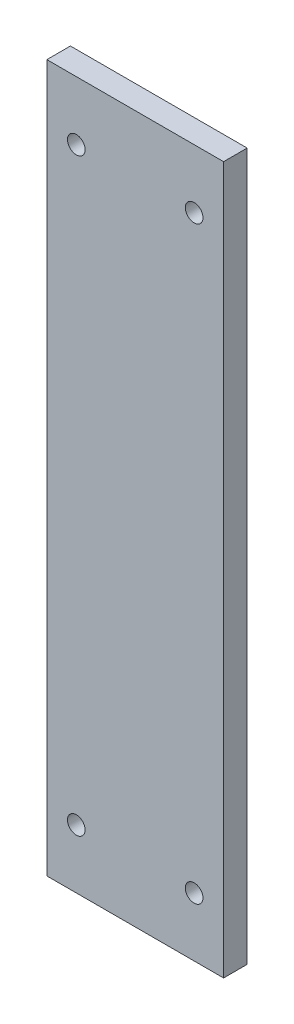
ISO-10303-21;
HEADER;
FILE_DESCRIPTION(('STEP AP214'),'2;1');
FILE_NAME('part.step','',(''),(''),'','','');
FILE_SCHEMA(('AUTOMOTIVE_DESIGN { 1 0 10303 214 1 1 1 1 }'));
ENDSEC;
DATA;
#1=APPLICATION_CONTEXT('core data for automotive mechanical design processes');
#2=APPLICATION_PROTOCOL_DEFINITION('international standard','automotive_design',2000,#1);
#3=PRODUCT_CONTEXT('',#1,'mechanical');
#4=PRODUCT('Part','Part','',(#3));
#5=PRODUCT_RELATED_PRODUCT_CATEGORY('part','',(#4));
#6=PRODUCT_DEFINITION_FORMATION('','',#4);
#7=PRODUCT_DEFINITION_CONTEXT('part definition',#1,'design');
#8=PRODUCT_DEFINITION('design','',#6,#7);
#9=PRODUCT_DEFINITION_SHAPE('','',#8);
#10=(LENGTH_UNIT() NAMED_UNIT(*) SI_UNIT(.MILLI.,.METRE.));
#11=(NAMED_UNIT(*) PLANE_ANGLE_UNIT() SI_UNIT($,.RADIAN.));
#12=(NAMED_UNIT(*) SI_UNIT($,.STERADIAN.) SOLID_ANGLE_UNIT());
#13=UNCERTAINTY_MEASURE_WITH_UNIT(LENGTH_MEASURE(1.E-05),#10,'distance_accuracy_value','');
#14=(GEOMETRIC_REPRESENTATION_CONTEXT(3) GLOBAL_UNCERTAINTY_ASSIGNED_CONTEXT((#13)) GLOBAL_UNIT_ASSIGNED_CONTEXT((#10,
#11,#12)) REPRESENTATION_CONTEXT('',''));
#15=CARTESIAN_POINT('',(0.,0.,0.));
#16=DIRECTION('',(0.,0.,1.));
#17=DIRECTION('',(1.,0.,0.));
#18=AXIS2_PLACEMENT_3D('',#15,#16,#17);
#19=CARTESIAN_POINT('',(0.,0.,4.));
#20=DIRECTION('',(0.,0.,1.));
#21=DIRECTION('',(1.,0.,0.));
#22=AXIS2_PLACEMENT_3D('',#19,#20,#21);
#23=PLANE('',#22);
#24=CARTESIAN_POINT('',(0.807491280048256,43.8432098136094,4.));
#25=DIRECTION('',(0.,0.,1.));
#26=DIRECTION('',(1.,0.,0.));
#27=AXIS2_PLACEMENT_3D('',#24,#25,#26);
#28=CIRCLE('',#27,1.50000000000002);
#29=CARTESIAN_POINT('',(2.30749128004828,43.8432098136094,4.));
#30=VERTEX_POINT('',#29);
#31=EDGE_CURVE('E152',#30,#30,#28,.T.);
#32=ORIENTED_EDGE('',*,*,#31,.F.);
#33=EDGE_LOOP('',(#32));
#34=FACE_BOUND('',#33,.T.);
#35=CARTESIAN_POINT('',(-19.1925087199518,-56.1567901863906,4.));
#36=DIRECTION('',(0.,0.,1.));
#37=DIRECTION('',(1.,0.,0.));
#38=AXIS2_PLACEMENT_3D('',#35,#36,#37);
#39=CIRCLE('',#38,1.50000000000002);
#40=CARTESIAN_POINT('',(-17.6925087199517,-56.1567901863906,4.));
#41=VERTEX_POINT('',#40);
#42=EDGE_CURVE('E122',#41,#41,#39,.T.);
#43=ORIENTED_EDGE('',*,*,#42,.F.);
#44=EDGE_LOOP('',(#43));
#45=FACE_BOUND('',#44,.T.);
#46=DIRECTION('',(-1.,0.,0.));
#47=VECTOR('',#46,1.);
#48=CARTESIAN_POINT('',(5.80749128004825,53.8432098136094,4.));
#49=LINE('',#48,#47);
#50=CARTESIAN_POINT('',(5.80749128004825,53.8432098136094,4.));
#51=VERTEX_POINT('',#50);
#52=CARTESIAN_POINT('',(-24.1925087199518,53.8432098136094,4.));
#53=VERTEX_POINT('',#52);
#54=EDGE_CURVE('E102',#51,#53,#49,.T.);
#55=ORIENTED_EDGE('',*,*,#54,.T.);
#56=DIRECTION('',(0.,-1.,0.));
#57=VECTOR('',#56,1.);
#58=CARTESIAN_POINT('',(-24.1925087199518,53.8432098136094,4.));
#59=LINE('',#58,#57);
#60=CARTESIAN_POINT('',(-24.1925087199518,-66.1567901863906,4.));
#61=VERTEX_POINT('',#60);
#62=EDGE_CURVE('E97',#53,#61,#59,.T.);
#63=ORIENTED_EDGE('',*,*,#62,.T.);
#64=DIRECTION('',(1.,0.,0.));
#65=VECTOR('',#64,1.);
#66=CARTESIAN_POINT('',(-24.1925087199518,-66.1567901863906,4.));
#67=LINE('',#66,#65);
#68=CARTESIAN_POINT('',(5.80749128004825,-66.1567901863906,4.));
#69=VERTEX_POINT('',#68);
#70=EDGE_CURVE('E100',#61,#69,#67,.T.);
#71=ORIENTED_EDGE('',*,*,#70,.T.);
#72=DIRECTION('',(0.,1.,0.));
#73=VECTOR('',#72,1.);
#74=CARTESIAN_POINT('',(5.80749128004825,-66.1567901863906,4.));
#75=LINE('',#74,#73);
#76=EDGE_CURVE('E67',#69,#51,#75,.T.);
#77=ORIENTED_EDGE('',*,*,#76,.T.);
#78=EDGE_LOOP('',(#55,#63,#71,#77));
#79=FACE_BOUND('',#78,.T.);
#80=CARTESIAN_POINT('',(0.807491280048256,-56.1567901863906,4.));
#81=DIRECTION('',(0.,0.,1.));
#82=DIRECTION('',(1.,0.,0.));
#83=AXIS2_PLACEMENT_3D('',#80,#81,#82);
#84=CIRCLE('',#83,1.50000000000004);
#85=CARTESIAN_POINT('',(2.30749128004829,-56.1567901863906,4.));
#86=VERTEX_POINT('',#85);
#87=EDGE_CURVE('E144',#86,#86,#84,.T.);
#88=ORIENTED_EDGE('',*,*,#87,.F.);
#89=EDGE_LOOP('',(#88));
#90=FACE_BOUND('',#89,.T.);
#91=CARTESIAN_POINT('',(-19.1925087199518,43.8432098136094,4.));
#92=DIRECTION('',(0.,0.,1.));
#93=DIRECTION('',(1.,0.,0.));
#94=AXIS2_PLACEMENT_3D('',#91,#92,#93);
#95=CIRCLE('',#94,1.50000000000002);
#96=CARTESIAN_POINT('',(-17.6925087199517,43.8432098136094,4.));
#97=VERTEX_POINT('',#96);
#98=EDGE_CURVE('E160',#97,#97,#95,.T.);
#99=ORIENTED_EDGE('',*,*,#98,.F.);
#100=EDGE_LOOP('',(#99));
#101=FACE_BOUND('',#100,.T.);
#102=ADVANCED_FACE('F49',(#34,#45,#79,#90,#101),#23,.T.);
#103=CARTESIAN_POINT('',(0.,0.,0.));
#104=DIRECTION('',(0.,0.,1.));
#105=DIRECTION('',(1.,0.,0.));
#106=AXIS2_PLACEMENT_3D('',#103,#104,#105);
#107=PLANE('',#106);
#108=DIRECTION('',(-1.,0.,0.));
#109=VECTOR('',#108,1.);
#110=CARTESIAN_POINT('',(5.80749128004825,53.8432098136094,0.));
#111=LINE('',#110,#109);
#112=CARTESIAN_POINT('',(5.80749128004825,53.8432098136094,0.));
#113=VERTEX_POINT('',#112);
#114=CARTESIAN_POINT('',(-24.1925087199518,53.8432098136094,0.));
#115=VERTEX_POINT('',#114);
#116=EDGE_CURVE('E118',#113,#115,#111,.T.);
#117=ORIENTED_EDGE('',*,*,#116,.F.);
#118=DIRECTION('',(0.,1.,0.));
#119=VECTOR('',#118,1.);
#120=CARTESIAN_POINT('',(5.80749128004825,-66.1567901863906,0.));
#121=LINE('',#120,#119);
#122=CARTESIAN_POINT('',(5.80749128004825,-66.1567901863906,0.));
#123=VERTEX_POINT('',#122);
#124=EDGE_CURVE('E90',#123,#113,#121,.T.);
#125=ORIENTED_EDGE('',*,*,#124,.F.);
#126=DIRECTION('',(1.,0.,0.));
#127=VECTOR('',#126,1.);
#128=CARTESIAN_POINT('',(-24.1925087199518,-66.1567901863906,0.));
#129=LINE('',#128,#127);
#130=CARTESIAN_POINT('',(-24.1925087199518,-66.1567901863906,0.));
#131=VERTEX_POINT('',#130);
#132=EDGE_CURVE('E84',#131,#123,#129,.T.);
#133=ORIENTED_EDGE('',*,*,#132,.F.);
#134=DIRECTION('',(0.,-1.,0.));
#135=VECTOR('',#134,1.);
#136=CARTESIAN_POINT('',(-24.1925087199518,53.8432098136094,0.));
#137=LINE('',#136,#135);
#138=EDGE_CURVE('E107',#115,#131,#137,.T.);
#139=ORIENTED_EDGE('',*,*,#138,.F.);
#140=EDGE_LOOP('',(#117,#125,#133,#139));
#141=FACE_BOUND('',#140,.T.);
#142=CARTESIAN_POINT('',(-19.1925087199518,-56.1567901863906,0.));
#143=DIRECTION('',(0.,0.,1.));
#144=DIRECTION('',(1.,0.,0.));
#145=AXIS2_PLACEMENT_3D('',#142,#143,#144);
#146=CIRCLE('',#145,1.50000000000002);
#147=CARTESIAN_POINT('',(-17.6925087199517,-56.1567901863906,0.));
#148=VERTEX_POINT('',#147);
#149=EDGE_CURVE('E140',#148,#148,#146,.T.);
#150=ORIENTED_EDGE('',*,*,#149,.T.);
#151=EDGE_LOOP('',(#150));
#152=FACE_BOUND('',#151,.T.);
#153=CARTESIAN_POINT('',(0.807491280048256,-56.1567901863906,0.));
#154=DIRECTION('',(0.,0.,1.));
#155=DIRECTION('',(1.,0.,0.));
#156=AXIS2_PLACEMENT_3D('',#153,#154,#155);
#157=CIRCLE('',#156,1.50000000000004);
#158=CARTESIAN_POINT('',(2.30749128004829,-56.1567901863906,0.));
#159=VERTEX_POINT('',#158);
#160=EDGE_CURVE('E148',#159,#159,#157,.T.);
#161=ORIENTED_EDGE('',*,*,#160,.T.);
#162=EDGE_LOOP('',(#161));
#163=FACE_BOUND('',#162,.T.);
#164=CARTESIAN_POINT('',(0.807491280048256,43.8432098136094,0.));
#165=DIRECTION('',(0.,0.,1.));
#166=DIRECTION('',(1.,0.,0.));
#167=AXIS2_PLACEMENT_3D('',#164,#165,#166);
#168=CIRCLE('',#167,1.50000000000002);
#169=CARTESIAN_POINT('',(2.30749128004828,43.8432098136094,0.));
#170=VERTEX_POINT('',#169);
#171=EDGE_CURVE('E156',#170,#170,#168,.T.);
#172=ORIENTED_EDGE('',*,*,#171,.T.);
#173=EDGE_LOOP('',(#172));
#174=FACE_BOUND('',#173,.T.);
#175=CARTESIAN_POINT('',(-19.1925087199518,43.8432098136094,0.));
#176=DIRECTION('',(0.,0.,1.));
#177=DIRECTION('',(1.,0.,0.));
#178=AXIS2_PLACEMENT_3D('',#175,#176,#177);
#179=CIRCLE('',#178,1.50000000000002);
#180=CARTESIAN_POINT('',(-17.6925087199517,43.8432098136094,0.));
#181=VERTEX_POINT('',#180);
#182=EDGE_CURVE('E164',#181,#181,#179,.T.);
#183=ORIENTED_EDGE('',*,*,#182,.T.);
#184=EDGE_LOOP('',(#183));
#185=FACE_BOUND('',#184,.T.);
#186=ADVANCED_FACE('F135',(#141,#152,#163,#174,#185),#107,.F.);
#187=CARTESIAN_POINT('',(5.80749128004825,53.8432098136094,4.));
#188=DIRECTION('',(0.,-1.,0.));
#189=DIRECTION('',(0.,0.,-1.));
#190=AXIS2_PLACEMENT_3D('',#187,#188,#189);
#191=PLANE('',#190);
#192=ORIENTED_EDGE('',*,*,#116,.T.);
#193=DIRECTION('',(0.,0.,-1.));
#194=VECTOR('',#193,1.);
#195=CARTESIAN_POINT('',(-24.1925087199518,53.8432098136094,4.));
#196=LINE('',#195,#194);
#197=EDGE_CURVE('E11',#53,#115,#196,.T.);
#198=ORIENTED_EDGE('',*,*,#197,.F.);
#199=ORIENTED_EDGE('',*,*,#54,.F.);
#200=DIRECTION('',(0.,0.,-1.));
#201=VECTOR('',#200,1.);
#202=CARTESIAN_POINT('',(5.80749128004825,53.8432098136094,4.));
#203=LINE('',#202,#201);
#204=EDGE_CURVE('E114',#51,#113,#203,.T.);
#205=ORIENTED_EDGE('',*,*,#204,.T.);
#206=EDGE_LOOP('',(#192,#198,#199,#205));
#207=FACE_BOUND('',#206,.T.);
#208=ADVANCED_FACE('F51',(#207),#191,.F.);
#209=CARTESIAN_POINT('',(-24.1925087199518,53.8432098136094,4.));
#210=DIRECTION('',(1.,0.,0.));
#211=DIRECTION('',(0.,1.,0.));
#212=AXIS2_PLACEMENT_3D('',#209,#210,#211);
#213=PLANE('',#212);
#214=ORIENTED_EDGE('',*,*,#138,.T.);
#215=DIRECTION('',(0.,0.,-1.));
#216=VECTOR('',#215,1.);
#217=CARTESIAN_POINT('',(-24.1925087199518,-66.1567901863906,4.));
#218=LINE('',#217,#216);
#219=EDGE_CURVE('E59',#61,#131,#218,.T.);
#220=ORIENTED_EDGE('',*,*,#219,.F.);
#221=ORIENTED_EDGE('',*,*,#62,.F.);
#222=ORIENTED_EDGE('',*,*,#197,.T.);
#223=EDGE_LOOP('',(#214,#220,#221,#222));
#224=FACE_BOUND('',#223,.T.);
#225=ADVANCED_FACE('F106',(#224),#213,.F.);
#226=CARTESIAN_POINT('',(-24.1925087199518,-66.1567901863906,4.));
#227=DIRECTION('',(0.,1.,0.));
#228=DIRECTION('',(0.,0.,1.));
#229=AXIS2_PLACEMENT_3D('',#226,#227,#228);
#230=PLANE('',#229);
#231=ORIENTED_EDGE('',*,*,#132,.T.);
#232=DIRECTION('',(0.,0.,-1.));
#233=VECTOR('',#232,1.);
#234=CARTESIAN_POINT('',(5.80749128004825,-66.1567901863906,4.));
#235=LINE('',#234,#233);
#236=EDGE_CURVE('E109',#69,#123,#235,.T.);
#237=ORIENTED_EDGE('',*,*,#236,.F.);
#238=ORIENTED_EDGE('',*,*,#70,.F.);
#239=ORIENTED_EDGE('',*,*,#219,.T.);
#240=EDGE_LOOP('',(#231,#237,#238,#239));
#241=FACE_BOUND('',#240,.T.);
#242=ADVANCED_FACE('F110',(#241),#230,.F.);
#243=CARTESIAN_POINT('',(5.80749128004825,-66.1567901863906,4.));
#244=DIRECTION('',(-1.,0.,0.));
#245=DIRECTION('',(0.,0.,1.));
#246=AXIS2_PLACEMENT_3D('',#243,#244,#245);
#247=PLANE('',#246);
#248=ORIENTED_EDGE('',*,*,#124,.T.);
#249=ORIENTED_EDGE('',*,*,#204,.F.);
#250=ORIENTED_EDGE('',*,*,#76,.F.);
#251=ORIENTED_EDGE('',*,*,#236,.T.);
#252=EDGE_LOOP('',(#248,#249,#250,#251));
#253=FACE_BOUND('',#252,.T.);
#254=ADVANCED_FACE('F132',(#253),#247,.F.);
#255=CARTESIAN_POINT('',(-19.1925087199518,-56.1567901863906,4.));
#256=DIRECTION('',(0.,0.,-1.));
#257=DIRECTION('',(-1.,0.,0.));
#258=AXIS2_PLACEMENT_3D('',#255,#256,#257);
#259=CYLINDRICAL_SURFACE('',#258,1.50000000000002);
#260=ORIENTED_EDGE('',*,*,#42,.T.);
#261=EDGE_LOOP('',(#260));
#262=FACE_BOUND('',#261,.T.);
#263=ORIENTED_EDGE('',*,*,#149,.F.);
#264=EDGE_LOOP('',(#263));
#265=FACE_BOUND('',#264,.T.);
#266=ADVANCED_FACE('F185',(#262,#265),#259,.F.);
#267=CARTESIAN_POINT('',(0.807491280048256,-56.1567901863906,4.));
#268=DIRECTION('',(0.,0.,-1.));
#269=DIRECTION('',(-1.,0.,0.));
#270=AXIS2_PLACEMENT_3D('',#267,#268,#269);
#271=CYLINDRICAL_SURFACE('',#270,1.50000000000004);
#272=ORIENTED_EDGE('',*,*,#87,.T.);
#273=EDGE_LOOP('',(#272));
#274=FACE_BOUND('',#273,.T.);
#275=ORIENTED_EDGE('',*,*,#160,.F.);
#276=EDGE_LOOP('',(#275));
#277=FACE_BOUND('',#276,.T.);
#278=ADVANCED_FACE('F253',(#274,#277),#271,.F.);
#279=CARTESIAN_POINT('',(0.807491280048256,43.8432098136094,4.));
#280=DIRECTION('',(0.,0.,-1.));
#281=DIRECTION('',(-1.,0.,0.));
#282=AXIS2_PLACEMENT_3D('',#279,#280,#281);
#283=CYLINDRICAL_SURFACE('',#282,1.50000000000002);
#284=ORIENTED_EDGE('',*,*,#31,.T.);
#285=EDGE_LOOP('',(#284));
#286=FACE_BOUND('',#285,.T.);
#287=ORIENTED_EDGE('',*,*,#171,.F.);
#288=EDGE_LOOP('',(#287));
#289=FACE_BOUND('',#288,.T.);
#290=ADVANCED_FACE('F264',(#286,#289),#283,.F.);
#291=CARTESIAN_POINT('',(-19.1925087199518,43.8432098136094,4.));
#292=DIRECTION('',(0.,0.,-1.));
#293=DIRECTION('',(-1.,0.,0.));
#294=AXIS2_PLACEMENT_3D('',#291,#292,#293);
#295=CYLINDRICAL_SURFACE('',#294,1.50000000000002);
#296=ORIENTED_EDGE('',*,*,#98,.T.);
#297=EDGE_LOOP('',(#296));
#298=FACE_BOUND('',#297,.T.);
#299=ORIENTED_EDGE('',*,*,#182,.F.);
#300=EDGE_LOOP('',(#299));
#301=FACE_BOUND('',#300,.T.);
#302=ADVANCED_FACE('F172',(#298,#301),#295,.F.);
#303=CLOSED_SHELL('',(#102,#186,#208,#225,#242,#254,#266,#278,#290,#302));
#304=MANIFOLD_SOLID_BREP('B2',#303);
#305=ADVANCED_BREP_SHAPE_REPRESENTATION('',(#18,#304),#14);
#306=SHAPE_DEFINITION_REPRESENTATION(#9,#305);
ENDSEC;
END-ISO-10303-21;
